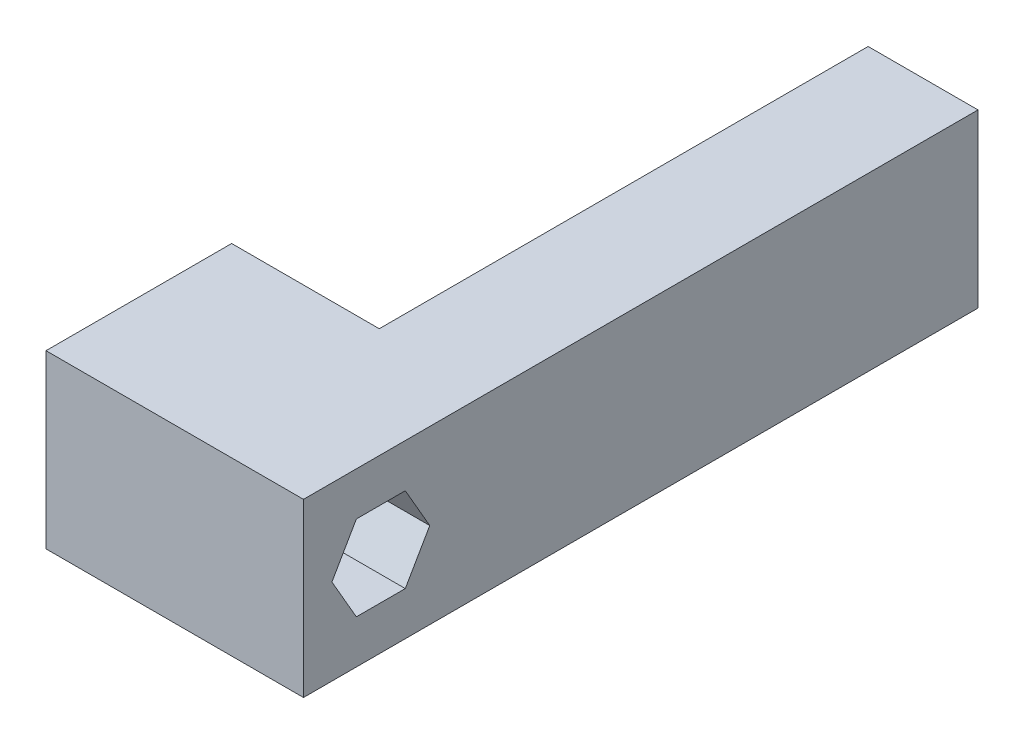
ISO-10303-21;
HEADER;
FILE_DESCRIPTION(('STEP AP214'),'2;1');
FILE_NAME('part.step','',(''),(''),'','','');
FILE_SCHEMA(('AUTOMOTIVE_DESIGN { 1 0 10303 214 1 1 1 1 }'));
ENDSEC;
DATA;
#1=APPLICATION_CONTEXT('core data for automotive mechanical design processes');
#2=APPLICATION_PROTOCOL_DEFINITION('international standard','automotive_design',2000,#1);
#3=PRODUCT_CONTEXT('',#1,'mechanical');
#4=PRODUCT('Part','Part','',(#3));
#5=PRODUCT_RELATED_PRODUCT_CATEGORY('part','',(#4));
#6=PRODUCT_DEFINITION_FORMATION('','',#4);
#7=PRODUCT_DEFINITION_CONTEXT('part definition',#1,'design');
#8=PRODUCT_DEFINITION('design','',#6,#7);
#9=PRODUCT_DEFINITION_SHAPE('','',#8);
#10=(LENGTH_UNIT() NAMED_UNIT(*) SI_UNIT(.MILLI.,.METRE.));
#11=(NAMED_UNIT(*) PLANE_ANGLE_UNIT() SI_UNIT($,.RADIAN.));
#12=(NAMED_UNIT(*) SI_UNIT($,.STERADIAN.) SOLID_ANGLE_UNIT());
#13=UNCERTAINTY_MEASURE_WITH_UNIT(LENGTH_MEASURE(1.E-05),#10,'distance_accuracy_value','');
#14=(GEOMETRIC_REPRESENTATION_CONTEXT(3) GLOBAL_UNCERTAINTY_ASSIGNED_CONTEXT((#13)) GLOBAL_UNIT_ASSIGNED_CONTEXT((#10,
#11,#12)) REPRESENTATION_CONTEXT('',''));
#15=CARTESIAN_POINT('',(0.,0.,0.));
#16=DIRECTION('',(0.,0.,1.));
#17=DIRECTION('',(1.,0.,0.));
#18=AXIS2_PLACEMENT_3D('',#15,#16,#17);
#19=CARTESIAN_POINT('',(0.,0.,-100.811469328144));
#20=DIRECTION('',(0.,0.,1.));
#21=DIRECTION('',(1.,0.,0.));
#22=AXIS2_PLACEMENT_3D('',#19,#20,#21);
#23=PLANE('',#22);
#24=DIRECTION('',(-1.,0.,0.));
#25=VECTOR('',#24,1.);
#26=CARTESIAN_POINT('',(0.,-25.4,-100.811469328144));
#27=LINE('',#26,#25);
#28=CARTESIAN_POINT('',(12.7,-25.4,-100.811469328144));
#29=VERTEX_POINT('',#28);
#30=CARTESIAN_POINT('',(-3.55599999999999,-25.4,-100.811469328144));
#31=VERTEX_POINT('',#30);
#32=EDGE_CURVE('E208',#29,#31,#27,.T.);
#33=ORIENTED_EDGE('',*,*,#32,.T.);
#34=DIRECTION('',(0.,-1.,0.));
#35=VECTOR('',#34,1.);
#36=CARTESIAN_POINT('',(-3.55599999999999,0.,-100.811469328144));
#37=LINE('',#36,#35);
#38=CARTESIAN_POINT('',(-3.55599999999999,0.,-100.811469328144));
#39=VERTEX_POINT('',#38);
#40=EDGE_CURVE('E245',#39,#31,#37,.T.);
#41=ORIENTED_EDGE('',*,*,#40,.F.);
#42=DIRECTION('',(1.,0.,0.));
#43=VECTOR('',#42,1.);
#44=CARTESIAN_POINT('',(0.,0.,-100.811469328144));
#45=LINE('',#44,#43);
#46=CARTESIAN_POINT('',(12.7,0.,-100.811469328144));
#47=VERTEX_POINT('',#46);
#48=EDGE_CURVE('E205',#39,#47,#45,.T.);
#49=ORIENTED_EDGE('',*,*,#48,.T.);
#50=DIRECTION('',(0.,-1.,0.));
#51=VECTOR('',#50,1.);
#52=CARTESIAN_POINT('',(12.7,0.,-100.811469328144));
#53=LINE('',#52,#51);
#54=EDGE_CURVE('E148',#47,#29,#53,.T.);
#55=ORIENTED_EDGE('',*,*,#54,.T.);
#56=EDGE_LOOP('',(#33,#41,#49,#55));
#57=FACE_BOUND('',#56,.T.);
#58=ADVANCED_FACE('F40',(#57),#23,.F.);
#59=CARTESIAN_POINT('',(12.7,0.,0.));
#60=DIRECTION('',(0.,1.,0.));
#61=DIRECTION('',(0.,0.,1.));
#62=AXIS2_PLACEMENT_3D('',#59,#60,#61);
#63=PLANE('',#62);
#64=DIRECTION('',(-1.,0.,0.));
#65=VECTOR('',#64,1.);
#66=CARTESIAN_POINT('',(12.7,0.,-1.));
#67=LINE('',#66,#65);
#68=CARTESIAN_POINT('',(12.7,0.,-1.));
#69=VERTEX_POINT('',#68);
#70=CARTESIAN_POINT('',(-25.4,0.,-1.00000000000001));
#71=VERTEX_POINT('',#70);
#72=EDGE_CURVE('E55',#69,#71,#67,.T.);
#73=ORIENTED_EDGE('',*,*,#72,.F.);
#74=DIRECTION('',(0.,0.,-1.));
#75=VECTOR('',#74,1.);
#76=CARTESIAN_POINT('',(12.7,0.,0.));
#77=LINE('',#76,#75);
#78=EDGE_CURVE('E138',#69,#47,#77,.T.);
#79=ORIENTED_EDGE('',*,*,#78,.T.);
#80=ORIENTED_EDGE('',*,*,#48,.F.);
#81=DIRECTION('',(0.,0.,-1.));
#82=VECTOR('',#81,1.);
#83=CARTESIAN_POINT('',(-3.55599999999999,0.,-100.811469328144));
#84=LINE('',#83,#82);
#85=CARTESIAN_POINT('',(-3.55599999999999,0.,-28.4713245616288));
#86=VERTEX_POINT('',#85);
#87=EDGE_CURVE('E238',#86,#39,#84,.T.);
#88=ORIENTED_EDGE('',*,*,#87,.F.);
#89=DIRECTION('',(1.,0.,0.));
#90=VECTOR('',#89,1.);
#91=CARTESIAN_POINT('',(-25.4,0.,-28.4713245616288));
#92=LINE('',#91,#90);
#93=CARTESIAN_POINT('',(-25.4,0.,-28.4713245616288));
#94=VERTEX_POINT('',#93);
#95=EDGE_CURVE('E201',#94,#86,#92,.T.);
#96=ORIENTED_EDGE('',*,*,#95,.F.);
#97=DIRECTION('',(0.,0.,-1.));
#98=VECTOR('',#97,1.);
#99=CARTESIAN_POINT('',(-25.4,0.,-28.4713245616288));
#100=LINE('',#99,#98);
#101=EDGE_CURVE('E141',#71,#94,#100,.T.);
#102=ORIENTED_EDGE('',*,*,#101,.F.);
#103=EDGE_LOOP('',(#73,#79,#80,#88,#96,#102));
#104=FACE_BOUND('',#103,.T.);
#105=ADVANCED_FACE('F137',(#104),#63,.T.);
#106=CARTESIAN_POINT('',(12.7,-25.4,0.));
#107=DIRECTION('',(0.,1.,0.));
#108=DIRECTION('',(0.,0.,1.));
#109=AXIS2_PLACEMENT_3D('',#106,#107,#108);
#110=PLANE('',#109);
#111=DIRECTION('',(0.,0.,-1.));
#112=VECTOR('',#111,1.);
#113=CARTESIAN_POINT('',(12.7,-25.4,0.));
#114=LINE('',#113,#112);
#115=CARTESIAN_POINT('',(12.7,-25.4,-1.));
#116=VERTEX_POINT('',#115);
#117=EDGE_CURVE('E149',#116,#29,#114,.T.);
#118=ORIENTED_EDGE('',*,*,#117,.F.);
#119=DIRECTION('',(1.,0.,0.));
#120=VECTOR('',#119,1.);
#121=CARTESIAN_POINT('',(12.7,-25.4,-1.));
#122=LINE('',#121,#120);
#123=CARTESIAN_POINT('',(-25.4,-25.4,-1.));
#124=VERTEX_POINT('',#123);
#125=EDGE_CURVE('E130',#124,#116,#122,.T.);
#126=ORIENTED_EDGE('',*,*,#125,.F.);
#127=DIRECTION('',(0.,0.,1.));
#128=VECTOR('',#127,1.);
#129=CARTESIAN_POINT('',(-25.4,-25.4,-28.4713245616288));
#130=LINE('',#129,#128);
#131=CARTESIAN_POINT('',(-25.4,-25.4,-28.4713245616288));
#132=VERTEX_POINT('',#131);
#133=EDGE_CURVE('E197',#132,#124,#130,.T.);
#134=ORIENTED_EDGE('',*,*,#133,.F.);
#135=DIRECTION('',(1.,0.,0.));
#136=VECTOR('',#135,1.);
#137=CARTESIAN_POINT('',(-25.4,-25.4,-28.4713245616288));
#138=LINE('',#137,#136);
#139=CARTESIAN_POINT('',(-3.55599999999999,-25.4,-28.4713245616288));
#140=VERTEX_POINT('',#139);
#141=EDGE_CURVE('E203',#132,#140,#138,.T.);
#142=ORIENTED_EDGE('',*,*,#141,.T.);
#143=DIRECTION('',(0.,0.,1.));
#144=VECTOR('',#143,1.);
#145=CARTESIAN_POINT('',(-3.55599999999999,-25.4,-100.811469328144));
#146=LINE('',#145,#144);
#147=EDGE_CURVE('E242',#31,#140,#146,.T.);
#148=ORIENTED_EDGE('',*,*,#147,.F.);
#149=ORIENTED_EDGE('',*,*,#32,.F.);
#150=EDGE_LOOP('',(#118,#126,#134,#142,#148,#149));
#151=FACE_BOUND('',#150,.T.);
#152=ADVANCED_FACE('F251',(#151),#110,.F.);
#153=CARTESIAN_POINT('',(12.7,-0.920302861247215,1.59401131403119));
#154=DIRECTION('',(0.,0.5,-0.866025403784439));
#155=DIRECTION('',(0.,0.866025403784439,0.5));
#156=AXIS2_PLACEMENT_3D('',#153,#154,#155);
#157=PLANE('',#156);
#158=DIRECTION('',(-1.,0.,0.));
#159=VECTOR('',#158,1.);
#160=CARTESIAN_POINT('',(12.7,-18.9691578979956,-8.8265));
#161=LINE('',#160,#159);
#162=CARTESIAN_POINT('',(12.7,-18.9691578979956,-8.8265));
#163=VERTEX_POINT('',#162);
#164=CARTESIAN_POINT('',(-25.4,-18.9691578979955,-8.82649999999994));
#165=VERTEX_POINT('',#164);
#166=EDGE_CURVE('E152',#163,#165,#161,.T.);
#167=ORIENTED_EDGE('',*,*,#166,.T.);
#168=DIRECTION('',(0.,0.866025403784444,0.499999999999991));
#169=VECTOR('',#168,1.);
#170=CARTESIAN_POINT('',(-25.4,-18.9691578979955,-8.82649999999994));
#171=LINE('',#170,#169);
#172=CARTESIAN_POINT('',(-25.4,-12.6999999999999,-5.207));
#173=VERTEX_POINT('',#172);
#174=EDGE_CURVE('E189',#165,#173,#171,.T.);
#175=ORIENTED_EDGE('',*,*,#174,.T.);
#176=DIRECTION('',(-1.,0.,0.));
#177=VECTOR('',#176,1.);
#178=CARTESIAN_POINT('',(12.7,-12.7,-5.207));
#179=LINE('',#178,#177);
#180=CARTESIAN_POINT('',(12.7,-12.7,-5.207));
#181=VERTEX_POINT('',#180);
#182=EDGE_CURVE('E11',#181,#173,#179,.T.);
#183=ORIENTED_EDGE('',*,*,#182,.F.);
#184=DIRECTION('',(0.,-0.866025403784439,-0.5));
#185=VECTOR('',#184,1.);
#186=CARTESIAN_POINT('',(12.7,-0.920302861247215,1.59401131403119));
#187=LINE('',#186,#185);
#188=EDGE_CURVE('E210',#181,#163,#187,.T.);
#189=ORIENTED_EDGE('',*,*,#188,.T.);
#190=EDGE_LOOP('',(#167,#175,#183,#189));
#191=FACE_BOUND('',#190,.T.);
#192=ADVANCED_FACE('F42',(#191),#157,.T.);
#193=CARTESIAN_POINT('',(12.7,-5.42969713875278,-9.40451131403119));
#194=DIRECTION('',(0.,-0.5,-0.866025403784439));
#195=DIRECTION('',(0.,0.866025403784439,-0.5));
#196=AXIS2_PLACEMENT_3D('',#193,#194,#195);
#197=PLANE('',#196);
#198=ORIENTED_EDGE('',*,*,#182,.T.);
#199=DIRECTION('',(0.,0.866025403784435,-0.500000000000005));
#200=VECTOR('',#199,1.);
#201=CARTESIAN_POINT('',(-25.4,-12.6999999999999,-5.207));
#202=LINE('',#201,#200);
#203=CARTESIAN_POINT('',(-25.4,-6.43084210200445,-8.8265));
#204=VERTEX_POINT('',#203);
#205=EDGE_CURVE('E182',#173,#204,#202,.T.);
#206=ORIENTED_EDGE('',*,*,#205,.T.);
#207=DIRECTION('',(-1.,0.,0.));
#208=VECTOR('',#207,1.);
#209=CARTESIAN_POINT('',(12.7,-6.43084210200445,-8.8265));
#210=LINE('',#209,#208);
#211=CARTESIAN_POINT('',(12.7,-6.43084210200445,-8.8265));
#212=VERTEX_POINT('',#211);
#213=EDGE_CURVE('E48',#212,#204,#210,.T.);
#214=ORIENTED_EDGE('',*,*,#213,.F.);
#215=DIRECTION('',(0.,-0.866025403784439,0.5));
#216=VECTOR('',#215,1.);
#217=CARTESIAN_POINT('',(12.7,-5.42969713875278,-9.40451131403119));
#218=LINE('',#217,#216);
#219=EDGE_CURVE('E213',#212,#181,#218,.T.);
#220=ORIENTED_EDGE('',*,*,#219,.T.);
#221=EDGE_LOOP('',(#198,#206,#214,#220));
#222=FACE_BOUND('',#221,.T.);
#223=ADVANCED_FACE('F188',(#222),#197,.T.);
#224=CARTESIAN_POINT('',(12.7,-6.43084210200445,0.));
#225=DIRECTION('',(0.,-1.,0.));
#226=DIRECTION('',(0.,0.,-1.));
#227=AXIS2_PLACEMENT_3D('',#224,#225,#226);
#228=PLANE('',#227);
#229=ORIENTED_EDGE('',*,*,#213,.T.);
#230=DIRECTION('',(0.,0.,-1.));
#231=VECTOR('',#230,1.);
#232=CARTESIAN_POINT('',(-25.4,-6.43084210200445,-8.8265));
#233=LINE('',#232,#231);
#234=CARTESIAN_POINT('',(-25.4,-6.43084210200446,-16.0655));
#235=VERTEX_POINT('',#234);
#236=EDGE_CURVE('E170',#204,#235,#233,.T.);
#237=ORIENTED_EDGE('',*,*,#236,.T.);
#238=DIRECTION('',(-1.,0.,0.));
#239=VECTOR('',#238,1.);
#240=CARTESIAN_POINT('',(12.7,-6.43084210200445,-16.0655));
#241=LINE('',#240,#239);
#242=CARTESIAN_POINT('',(12.7,-6.43084210200445,-16.0655));
#243=VERTEX_POINT('',#242);
#244=EDGE_CURVE('E164',#243,#235,#241,.T.);
#245=ORIENTED_EDGE('',*,*,#244,.F.);
#246=DIRECTION('',(0.,0.,1.));
#247=VECTOR('',#246,1.);
#248=CARTESIAN_POINT('',(12.7,-6.43084210200445,0.));
#249=LINE('',#248,#247);
#250=EDGE_CURVE('E172',#243,#212,#249,.T.);
#251=ORIENTED_EDGE('',*,*,#250,.T.);
#252=EDGE_LOOP('',(#229,#237,#245,#251));
#253=FACE_BOUND('',#252,.T.);
#254=ADVANCED_FACE('F169',(#253),#228,.T.);
#255=CARTESIAN_POINT('',(12.7,5.34885503674834,-9.2644886859688));
#256=DIRECTION('',(0.,-0.5,0.866025403784438));
#257=DIRECTION('',(0.,-0.866025403784438,-0.500000000000001));
#258=AXIS2_PLACEMENT_3D('',#255,#256,#257);
#259=PLANE('',#258);
#260=ORIENTED_EDGE('',*,*,#244,.T.);
#261=DIRECTION('',(0.,-0.866025403784441,-0.499999999999997));
#262=VECTOR('',#261,1.);
#263=CARTESIAN_POINT('',(-25.4,-6.43084210200446,-16.0655));
#264=LINE('',#263,#262);
#265=CARTESIAN_POINT('',(-25.4,-12.7,-19.685));
#266=VERTEX_POINT('',#265);
#267=EDGE_CURVE('E186',#235,#266,#264,.T.);
#268=ORIENTED_EDGE('',*,*,#267,.T.);
#269=DIRECTION('',(-1.,0.,0.));
#270=VECTOR('',#269,1.);
#271=CARTESIAN_POINT('',(12.7,-12.7,-19.685));
#272=LINE('',#271,#270);
#273=CARTESIAN_POINT('',(12.7,-12.7,-19.685));
#274=VERTEX_POINT('',#273);
#275=EDGE_CURVE('E162',#274,#266,#272,.T.);
#276=ORIENTED_EDGE('',*,*,#275,.F.);
#277=DIRECTION('',(0.,0.866025403784438,0.5));
#278=VECTOR('',#277,1.);
#279=CARTESIAN_POINT('',(12.7,5.34885503674834,-9.2644886859688));
#280=LINE('',#279,#278);
#281=EDGE_CURVE('E216',#274,#243,#280,.T.);
#282=ORIENTED_EDGE('',*,*,#281,.T.);
#283=EDGE_LOOP('',(#260,#268,#276,#282));
#284=FACE_BOUND('',#283,.T.);
#285=ADVANCED_FACE('F233',(#284),#259,.T.);
#286=CARTESIAN_POINT('',(12.7,-11.6988550367483,-20.2630113140312));
#287=DIRECTION('',(0.,0.5,0.866025403784439));
#288=DIRECTION('',(0.,-0.866025403784439,0.5));
#289=AXIS2_PLACEMENT_3D('',#286,#287,#288);
#290=PLANE('',#289);
#291=ORIENTED_EDGE('',*,*,#275,.T.);
#292=DIRECTION('',(0.,-0.866025403784435,0.500000000000006));
#293=VECTOR('',#292,1.);
#294=CARTESIAN_POINT('',(-25.4,-12.7,-19.685));
#295=LINE('',#294,#293);
#296=CARTESIAN_POINT('',(-25.4,-18.9691578979956,-16.0655));
#297=VERTEX_POINT('',#296);
#298=EDGE_CURVE('E234',#266,#297,#295,.T.);
#299=ORIENTED_EDGE('',*,*,#298,.T.);
#300=DIRECTION('',(-1.,0.,0.));
#301=VECTOR('',#300,1.);
#302=CARTESIAN_POINT('',(12.7,-18.9691578979956,-16.0655));
#303=LINE('',#302,#301);
#304=CARTESIAN_POINT('',(12.7,-18.9691578979956,-16.0655));
#305=VERTEX_POINT('',#304);
#306=EDGE_CURVE('E160',#305,#297,#303,.T.);
#307=ORIENTED_EDGE('',*,*,#306,.F.);
#308=DIRECTION('',(0.,0.866025403784439,-0.5));
#309=VECTOR('',#308,1.);
#310=CARTESIAN_POINT('',(12.7,-11.6988550367483,-20.2630113140312));
#311=LINE('',#310,#309);
#312=EDGE_CURVE('E155',#305,#274,#311,.T.);
#313=ORIENTED_EDGE('',*,*,#312,.T.);
#314=EDGE_LOOP('',(#291,#299,#307,#313));
#315=FACE_BOUND('',#314,.T.);
#316=ADVANCED_FACE('F221',(#315),#290,.T.);
#317=CARTESIAN_POINT('',(12.7,-18.9691578979956,0.));
#318=DIRECTION('',(0.,1.,0.));
#319=DIRECTION('',(0.,0.,1.));
#320=AXIS2_PLACEMENT_3D('',#317,#318,#319);
#321=PLANE('',#320);
#322=ORIENTED_EDGE('',*,*,#306,.T.);
#323=DIRECTION('',(0.,0.,1.));
#324=VECTOR('',#323,1.);
#325=CARTESIAN_POINT('',(-25.4,-18.9691578979956,-16.0655));
#326=LINE('',#325,#324);
#327=EDGE_CURVE('E230',#297,#165,#326,.T.);
#328=ORIENTED_EDGE('',*,*,#327,.T.);
#329=ORIENTED_EDGE('',*,*,#166,.F.);
#330=DIRECTION('',(0.,0.,-1.));
#331=VECTOR('',#330,1.);
#332=CARTESIAN_POINT('',(12.7,-18.9691578979956,0.));
#333=LINE('',#332,#331);
#334=EDGE_CURVE('E150',#163,#305,#333,.T.);
#335=ORIENTED_EDGE('',*,*,#334,.T.);
#336=EDGE_LOOP('',(#322,#328,#329,#335));
#337=FACE_BOUND('',#336,.T.);
#338=ADVANCED_FACE('F227',(#337),#321,.T.);
#339=CARTESIAN_POINT('',(12.7,0.,0.));
#340=DIRECTION('',(1.,0.,0.));
#341=DIRECTION('',(0.,0.,-1.));
#342=AXIS2_PLACEMENT_3D('',#339,#340,#341);
#343=PLANE('',#342);
#344=DIRECTION('',(0.,1.,0.));
#345=VECTOR('',#344,1.);
#346=CARTESIAN_POINT('',(12.7,0.,-1.));
#347=LINE('',#346,#345);
#348=EDGE_CURVE('E127',#116,#69,#347,.T.);
#349=ORIENTED_EDGE('',*,*,#348,.F.);
#350=ORIENTED_EDGE('',*,*,#117,.T.);
#351=ORIENTED_EDGE('',*,*,#54,.F.);
#352=ORIENTED_EDGE('',*,*,#78,.F.);
#353=EDGE_LOOP('',(#349,#350,#351,#352));
#354=FACE_BOUND('',#353,.T.);
#355=ORIENTED_EDGE('',*,*,#188,.F.);
#356=ORIENTED_EDGE('',*,*,#219,.F.);
#357=ORIENTED_EDGE('',*,*,#250,.F.);
#358=ORIENTED_EDGE('',*,*,#281,.F.);
#359=ORIENTED_EDGE('',*,*,#312,.F.);
#360=ORIENTED_EDGE('',*,*,#334,.F.);
#361=EDGE_LOOP('',(#355,#356,#357,#358,#359,#360));
#362=FACE_BOUND('',#361,.T.);
#363=ADVANCED_FACE('F145',(#354,#362),#343,.T.);
#364=CARTESIAN_POINT('',(-25.4,0.,-28.4713245616288));
#365=DIRECTION('',(0.,0.,1.));
#366=DIRECTION('',(1.,0.,0.));
#367=AXIS2_PLACEMENT_3D('',#364,#365,#366);
#368=PLANE('',#367);
#369=ORIENTED_EDGE('',*,*,#95,.T.);
#370=DIRECTION('',(0.,1.,0.));
#371=VECTOR('',#370,1.);
#372=CARTESIAN_POINT('',(-3.55599999999999,0.,-28.4713245616288));
#373=LINE('',#372,#371);
#374=EDGE_CURVE('E63',#140,#86,#373,.T.);
#375=ORIENTED_EDGE('',*,*,#374,.F.);
#376=ORIENTED_EDGE('',*,*,#141,.F.);
#377=DIRECTION('',(0.,-1.,0.));
#378=VECTOR('',#377,1.);
#379=CARTESIAN_POINT('',(-25.4,0.,-28.4713245616288));
#380=LINE('',#379,#378);
#381=EDGE_CURVE('E191',#94,#132,#380,.T.);
#382=ORIENTED_EDGE('',*,*,#381,.F.);
#383=EDGE_LOOP('',(#369,#375,#376,#382));
#384=FACE_BOUND('',#383,.T.);
#385=ADVANCED_FACE('F254',(#384),#368,.F.);
#386=CARTESIAN_POINT('',(-25.4,0.,0.));
#387=DIRECTION('',(-1.,0.,0.));
#388=DIRECTION('',(0.,0.,1.));
#389=AXIS2_PLACEMENT_3D('',#386,#387,#388);
#390=PLANE('',#389);
#391=DIRECTION('',(0.,-1.,0.));
#392=VECTOR('',#391,1.);
#393=CARTESIAN_POINT('',(-25.4,0.,-1.));
#394=LINE('',#393,#392);
#395=EDGE_CURVE('E142',#71,#124,#394,.T.);
#396=ORIENTED_EDGE('',*,*,#395,.F.);
#397=ORIENTED_EDGE('',*,*,#101,.T.);
#398=ORIENTED_EDGE('',*,*,#381,.T.);
#399=ORIENTED_EDGE('',*,*,#133,.T.);
#400=EDGE_LOOP('',(#396,#397,#398,#399));
#401=FACE_BOUND('',#400,.T.);
#402=ORIENTED_EDGE('',*,*,#205,.F.);
#403=ORIENTED_EDGE('',*,*,#174,.F.);
#404=ORIENTED_EDGE('',*,*,#327,.F.);
#405=ORIENTED_EDGE('',*,*,#298,.F.);
#406=ORIENTED_EDGE('',*,*,#267,.F.);
#407=ORIENTED_EDGE('',*,*,#236,.F.);
#408=EDGE_LOOP('',(#402,#403,#404,#405,#406,#407));
#409=FACE_BOUND('',#408,.T.);
#410=ADVANCED_FACE('F180',(#401,#409),#390,.T.);
#411=CARTESIAN_POINT('',(-3.55599999999999,0.,0.));
#412=DIRECTION('',(-1.,0.,0.));
#413=DIRECTION('',(0.,0.,1.));
#414=AXIS2_PLACEMENT_3D('',#411,#412,#413);
#415=PLANE('',#414);
#416=ORIENTED_EDGE('',*,*,#40,.T.);
#417=ORIENTED_EDGE('',*,*,#147,.T.);
#418=ORIENTED_EDGE('',*,*,#374,.T.);
#419=ORIENTED_EDGE('',*,*,#87,.T.);
#420=EDGE_LOOP('',(#416,#417,#418,#419));
#421=FACE_BOUND('',#420,.T.);
#422=ADVANCED_FACE('F257',(#421),#415,.T.);
#423=CARTESIAN_POINT('',(0.,0.,-1.));
#424=DIRECTION('',(0.,0.,-1.));
#425=DIRECTION('',(-1.,0.,0.));
#426=AXIS2_PLACEMENT_3D('',#423,#424,#425);
#427=PLANE('',#426);
#428=ORIENTED_EDGE('',*,*,#348,.T.);
#429=ORIENTED_EDGE('',*,*,#72,.T.);
#430=ORIENTED_EDGE('',*,*,#395,.T.);
#431=ORIENTED_EDGE('',*,*,#125,.T.);
#432=EDGE_LOOP('',(#428,#429,#430,#431));
#433=FACE_BOUND('',#432,.T.);
#434=ADVANCED_FACE('F128',(#433),#427,.F.);
#435=CLOSED_SHELL('',(#58,#105,#152,#192,#223,#254,#285,#316,#338,#363,#385,#410,#422,#434));
#436=MANIFOLD_SOLID_BREP('B2',#435);
#437=ADVANCED_BREP_SHAPE_REPRESENTATION('',(#18,#436),#14);
#438=SHAPE_DEFINITION_REPRESENTATION(#9,#437);
ENDSEC;
END-ISO-10303-21;
